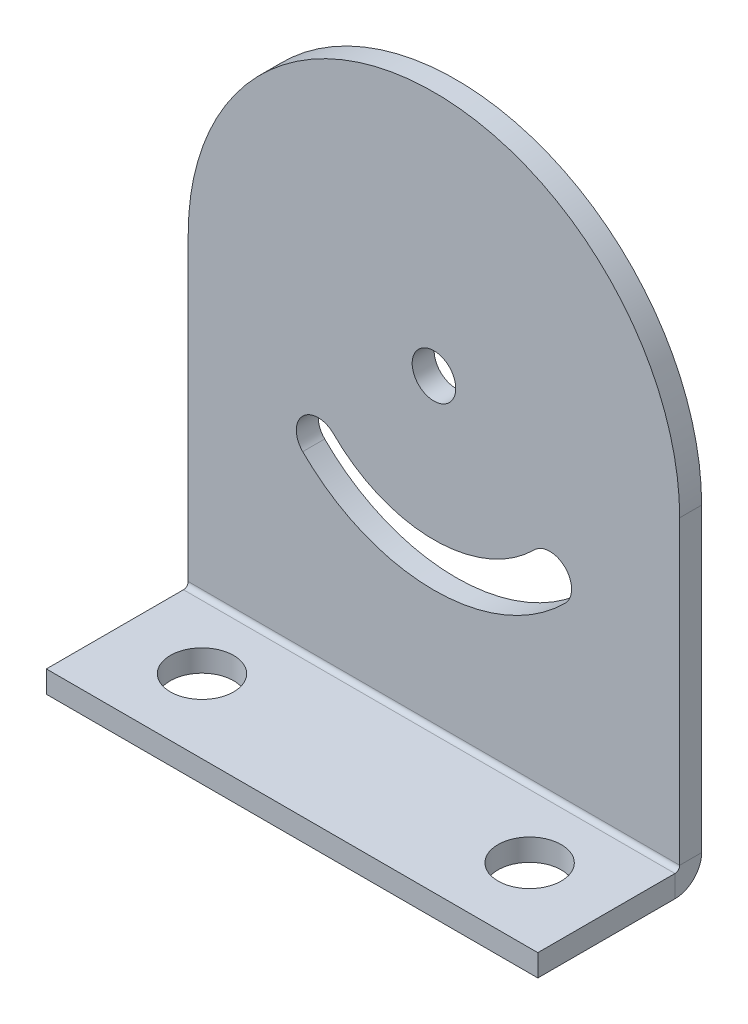
ISO-10303-21;
HEADER;
FILE_DESCRIPTION(('STEP AP214'),'2;1');
FILE_NAME('part.step','',(''),(''),'','','');
FILE_SCHEMA(('AUTOMOTIVE_DESIGN { 1 0 10303 214 1 1 1 1 }'));
ENDSEC;
DATA;
#1=APPLICATION_CONTEXT('core data for automotive mechanical design processes');
#2=APPLICATION_PROTOCOL_DEFINITION('international standard','automotive_design',2000,#1);
#3=PRODUCT_CONTEXT('',#1,'mechanical');
#4=PRODUCT('Part','Part','',(#3));
#5=PRODUCT_RELATED_PRODUCT_CATEGORY('part','',(#4));
#6=PRODUCT_DEFINITION_FORMATION('','',#4);
#7=PRODUCT_DEFINITION_CONTEXT('part definition',#1,'design');
#8=PRODUCT_DEFINITION('design','',#6,#7);
#9=PRODUCT_DEFINITION_SHAPE('','',#8);
#10=(LENGTH_UNIT() NAMED_UNIT(*) SI_UNIT(.MILLI.,.METRE.));
#11=(NAMED_UNIT(*) PLANE_ANGLE_UNIT() SI_UNIT($,.RADIAN.));
#12=(NAMED_UNIT(*) SI_UNIT($,.STERADIAN.) SOLID_ANGLE_UNIT());
#13=UNCERTAINTY_MEASURE_WITH_UNIT(LENGTH_MEASURE(1.E-05),#10,'distance_accuracy_value','');
#14=(GEOMETRIC_REPRESENTATION_CONTEXT(3) GLOBAL_UNCERTAINTY_ASSIGNED_CONTEXT((#13)) GLOBAL_UNIT_ASSIGNED_CONTEXT((#10,
#11,#12)) REPRESENTATION_CONTEXT('',''));
#15=CARTESIAN_POINT('',(0.,0.,0.));
#16=DIRECTION('',(0.,0.,1.));
#17=DIRECTION('',(1.,0.,0.));
#18=AXIS2_PLACEMENT_3D('',#15,#16,#17);
#19=CARTESIAN_POINT('',(0.,0.,-3.4036));
#20=DIRECTION('',(1.,0.,0.));
#21=DIRECTION('',(0.,1.,0.));
#22=AXIS2_PLACEMENT_3D('',#19,#20,#21);
#23=PLANE('',#22);
#24=DIRECTION('',(0.,1.,0.));
#25=VECTOR('',#24,1.);
#26=CARTESIAN_POINT('',(0.,0.,0.));
#27=LINE('',#26,#25);
#28=CARTESIAN_POINT('',(0.,-46.6598,0.));
#29=VERTEX_POINT('',#28);
#30=CARTESIAN_POINT('',(0.,0.,0.));
#31=VERTEX_POINT('',#30);
#32=EDGE_CURVE('E259',#29,#31,#27,.T.);
#33=ORIENTED_EDGE('',*,*,#32,.F.);
#34=DIRECTION('',(0.,0.,-1.));
#35=VECTOR('',#34,1.);
#36=CARTESIAN_POINT('',(0.,-46.6598,0.));
#37=LINE('',#36,#35);
#38=CARTESIAN_POINT('',(0.,-46.6598,-3.4036));
#39=VERTEX_POINT('',#38);
#40=EDGE_CURVE('E238',#29,#39,#37,.T.);
#41=ORIENTED_EDGE('',*,*,#40,.T.);
#42=DIRECTION('',(0.,1.,0.));
#43=VECTOR('',#42,1.);
#44=CARTESIAN_POINT('',(0.,0.,-3.4036));
#45=LINE('',#44,#43);
#46=CARTESIAN_POINT('',(0.,0.,-3.4036));
#47=VERTEX_POINT('',#46);
#48=EDGE_CURVE('E262',#39,#47,#45,.T.);
#49=ORIENTED_EDGE('',*,*,#48,.T.);
#50=DIRECTION('',(0.,0.,1.));
#51=VECTOR('',#50,1.);
#52=CARTESIAN_POINT('',(0.,0.,-3.4036));
#53=LINE('',#52,#51);
#54=EDGE_CURVE('E13',#47,#31,#53,.T.);
#55=ORIENTED_EDGE('',*,*,#54,.T.);
#56=EDGE_LOOP('',(#33,#41,#49,#55));
#57=FACE_BOUND('',#56,.T.);
#58=ADVANCED_FACE('F58',(#57),#23,.T.);
#59=CARTESIAN_POINT('',(-38.1,0.,-3.4036));
#60=DIRECTION('',(0.,0.,1.));
#61=DIRECTION('',(1.,0.,0.));
#62=AXIS2_PLACEMENT_3D('',#59,#60,#61);
#63=PLANE('',#62);
#64=CARTESIAN_POINT('',(-38.1,0.,-3.4036));
#65=DIRECTION('',(0.,0.,-1.));
#66=DIRECTION('',(1.,0.,0.));
#67=AXIS2_PLACEMENT_3D('',#64,#65,#66);
#68=CIRCLE('',#67,22.0194525515466);
#69=CARTESIAN_POINT('',(-22.529895782786,-15.570104217214,-3.4036));
#70=VERTEX_POINT('',#69);
#71=CARTESIAN_POINT('',(-53.670104217214,-15.570104217214,-3.4036));
#72=VERTEX_POINT('',#71);
#73=EDGE_CURVE('E155',#70,#72,#68,.T.);
#74=ORIENTED_EDGE('',*,*,#73,.T.);
#75=CARTESIAN_POINT('',(-56.0588523454184,-17.9588523454184,-3.4036));
#76=DIRECTION('',(0.,0.,1.));
#77=DIRECTION('',(1.,0.,0.));
#78=AXIS2_PLACEMENT_3D('',#75,#76,#77);
#79=CIRCLE('',#78,3.3782);
#80=CARTESIAN_POINT('',(-58.4476004736228,-20.3476004736227,-3.4036));
#81=VERTEX_POINT('',#80);
#82=EDGE_CURVE('E149',#72,#81,#79,.T.);
#83=ORIENTED_EDGE('',*,*,#82,.T.);
#84=CARTESIAN_POINT('',(-38.1,0.,-3.4036));
#85=DIRECTION('',(0.,0.,1.));
#86=DIRECTION('',(1.,0.,0.));
#87=AXIS2_PLACEMENT_3D('',#84,#85,#86);
#88=CIRCLE('',#87,28.7758525515465);
#89=CARTESIAN_POINT('',(-17.7523995263772,-20.3476004736228,-3.4036));
#90=VERTEX_POINT('',#89);
#91=EDGE_CURVE('E158',#81,#90,#88,.T.);
#92=ORIENTED_EDGE('',*,*,#91,.T.);
#93=CARTESIAN_POINT('',(-20.1411476545816,-17.9588523454184,-3.4036));
#94=DIRECTION('',(0.,0.,1.));
#95=DIRECTION('',(1.,0.,0.));
#96=AXIS2_PLACEMENT_3D('',#93,#94,#95);
#97=CIRCLE('',#96,3.3782);
#98=EDGE_CURVE('E73',#90,#70,#97,.T.);
#99=ORIENTED_EDGE('',*,*,#98,.T.);
#100=EDGE_LOOP('',(#74,#83,#92,#99));
#101=FACE_BOUND('',#100,.T.);
#102=CARTESIAN_POINT('',(-38.1,0.,-3.4036));
#103=DIRECTION('',(0.,0.,1.));
#104=DIRECTION('',(1.,0.,0.));
#105=AXIS2_PLACEMENT_3D('',#102,#103,#104);
#106=CIRCLE('',#105,3.3782);
#107=CARTESIAN_POINT('',(-34.7218,0.,-3.4036));
#108=VERTEX_POINT('',#107);
#109=EDGE_CURVE('E186',#108,#108,#106,.T.);
#110=ORIENTED_EDGE('',*,*,#109,.T.);
#111=EDGE_LOOP('',(#110));
#112=FACE_BOUND('',#111,.T.);
#113=DIRECTION('',(1.,0.,0.));
#114=VECTOR('',#113,1.);
#115=CARTESIAN_POINT('',(0.,-46.6598,-3.4036));
#116=LINE('',#115,#114);
#117=CARTESIAN_POINT('',(-76.2,-46.6598,-3.4036));
#118=VERTEX_POINT('',#117);
#119=EDGE_CURVE('E232',#39,#118,#116,.F.);
#120=ORIENTED_EDGE('',*,*,#119,.T.);
#121=DIRECTION('',(0.,-1.,0.));
#122=VECTOR('',#121,1.);
#123=CARTESIAN_POINT('',(-76.2,-50.8,-3.4036));
#124=LINE('',#123,#122);
#125=CARTESIAN_POINT('',(-76.2,0.,-3.4036));
#126=VERTEX_POINT('',#125);
#127=EDGE_CURVE('E258',#126,#118,#124,.T.);
#128=ORIENTED_EDGE('',*,*,#127,.F.);
#129=CARTESIAN_POINT('',(-38.1,0.,-3.4036));
#130=DIRECTION('',(0.,0.,1.));
#131=DIRECTION('',(1.,0.,0.));
#132=AXIS2_PLACEMENT_3D('',#129,#130,#131);
#133=CIRCLE('',#132,38.1);
#134=EDGE_CURVE('E255',#47,#126,#133,.T.);
#135=ORIENTED_EDGE('',*,*,#134,.F.);
#136=ORIENTED_EDGE('',*,*,#48,.F.);
#137=EDGE_LOOP('',(#120,#128,#135,#136));
#138=FACE_BOUND('',#137,.T.);
#139=ADVANCED_FACE('F162',(#101,#112,#138),#63,.F.);
#140=CARTESIAN_POINT('',(-38.1,0.,0.));
#141=DIRECTION('',(0.,0.,1.));
#142=DIRECTION('',(1.,0.,0.));
#143=AXIS2_PLACEMENT_3D('',#140,#141,#142);
#144=PLANE('',#143);
#145=CARTESIAN_POINT('',(-56.0588523454184,-17.9588523454184,0.));
#146=DIRECTION('',(0.,0.,1.));
#147=DIRECTION('',(1.,0.,0.));
#148=AXIS2_PLACEMENT_3D('',#145,#146,#147);
#149=CIRCLE('',#148,3.3782);
#150=CARTESIAN_POINT('',(-53.670104217214,-15.570104217214,0.));
#151=VERTEX_POINT('',#150);
#152=CARTESIAN_POINT('',(-58.4476004736228,-20.3476004736227,0.));
#153=VERTEX_POINT('',#152);
#154=EDGE_CURVE('E81',#151,#153,#149,.T.);
#155=ORIENTED_EDGE('',*,*,#154,.F.);
#156=CARTESIAN_POINT('',(-38.1,0.,0.));
#157=DIRECTION('',(0.,0.,-1.));
#158=DIRECTION('',(1.,0.,0.));
#159=AXIS2_PLACEMENT_3D('',#156,#157,#158);
#160=CIRCLE('',#159,22.0194525515466);
#161=CARTESIAN_POINT('',(-22.529895782786,-15.570104217214,0.));
#162=VERTEX_POINT('',#161);
#163=EDGE_CURVE('E165',#162,#151,#160,.T.);
#164=ORIENTED_EDGE('',*,*,#163,.F.);
#165=CARTESIAN_POINT('',(-20.1411476545816,-17.9588523454184,0.));
#166=DIRECTION('',(0.,0.,1.));
#167=DIRECTION('',(1.,0.,0.));
#168=AXIS2_PLACEMENT_3D('',#165,#166,#167);
#169=CIRCLE('',#168,3.3782);
#170=CARTESIAN_POINT('',(-17.7523995263772,-20.3476004736228,0.));
#171=VERTEX_POINT('',#170);
#172=EDGE_CURVE('E168',#171,#162,#169,.T.);
#173=ORIENTED_EDGE('',*,*,#172,.F.);
#174=CARTESIAN_POINT('',(-38.1,0.,0.));
#175=DIRECTION('',(0.,0.,1.));
#176=DIRECTION('',(1.,0.,0.));
#177=AXIS2_PLACEMENT_3D('',#174,#175,#176);
#178=CIRCLE('',#177,28.7758525515465);
#179=EDGE_CURVE('E174',#153,#171,#178,.T.);
#180=ORIENTED_EDGE('',*,*,#179,.F.);
#181=EDGE_LOOP('',(#155,#164,#173,#180));
#182=FACE_BOUND('',#181,.T.);
#183=CARTESIAN_POINT('',(-38.1,0.,0.));
#184=DIRECTION('',(0.,0.,1.));
#185=DIRECTION('',(1.,0.,0.));
#186=AXIS2_PLACEMENT_3D('',#183,#184,#185);
#187=CIRCLE('',#186,3.3782);
#188=CARTESIAN_POINT('',(-34.7218,0.,0.));
#189=VERTEX_POINT('',#188);
#190=EDGE_CURVE('E180',#189,#189,#187,.T.);
#191=ORIENTED_EDGE('',*,*,#190,.F.);
#192=EDGE_LOOP('',(#191));
#193=FACE_BOUND('',#192,.T.);
#194=DIRECTION('',(0.,-1.,0.));
#195=VECTOR('',#194,1.);
#196=CARTESIAN_POINT('',(-76.2,-50.8,0.));
#197=LINE('',#196,#195);
#198=CARTESIAN_POINT('',(-76.2,0.,0.));
#199=VERTEX_POINT('',#198);
#200=CARTESIAN_POINT('',(-76.2,-46.6598,0.));
#201=VERTEX_POINT('',#200);
#202=EDGE_CURVE('E266',#199,#201,#197,.T.);
#203=ORIENTED_EDGE('',*,*,#202,.T.);
#204=DIRECTION('',(1.,0.,0.));
#205=VECTOR('',#204,1.);
#206=CARTESIAN_POINT('',(0.,-46.6598,0.));
#207=LINE('',#206,#205);
#208=EDGE_CURVE('E244',#29,#201,#207,.F.);
#209=ORIENTED_EDGE('',*,*,#208,.F.);
#210=ORIENTED_EDGE('',*,*,#32,.T.);
#211=CARTESIAN_POINT('',(-38.1,0.,0.));
#212=DIRECTION('',(0.,0.,1.));
#213=DIRECTION('',(1.,0.,0.));
#214=AXIS2_PLACEMENT_3D('',#211,#212,#213);
#215=CIRCLE('',#214,38.1);
#216=EDGE_CURVE('E252',#31,#199,#215,.T.);
#217=ORIENTED_EDGE('',*,*,#216,.T.);
#218=EDGE_LOOP('',(#203,#209,#210,#217));
#219=FACE_BOUND('',#218,.T.);
#220=ADVANCED_FACE('F271',(#182,#193,#219),#144,.T.);
#221=CARTESIAN_POINT('',(-38.1,0.,-3.4036));
#222=DIRECTION('',(0.,0.,1.));
#223=DIRECTION('',(1.,0.,0.));
#224=AXIS2_PLACEMENT_3D('',#221,#222,#223);
#225=CYLINDRICAL_SURFACE('',#224,38.1);
#226=ORIENTED_EDGE('',*,*,#216,.F.);
#227=ORIENTED_EDGE('',*,*,#54,.F.);
#228=ORIENTED_EDGE('',*,*,#134,.T.);
#229=DIRECTION('',(0.,0.,1.));
#230=VECTOR('',#229,1.);
#231=CARTESIAN_POINT('',(-76.2,0.,-3.4036));
#232=LINE('',#231,#230);
#233=EDGE_CURVE('E62',#126,#199,#232,.T.);
#234=ORIENTED_EDGE('',*,*,#233,.T.);
#235=EDGE_LOOP('',(#226,#227,#228,#234));
#236=FACE_BOUND('',#235,.T.);
#237=ADVANCED_FACE('F60',(#236),#225,.T.);
#238=CARTESIAN_POINT('',(-76.2,-50.8,-3.4036));
#239=DIRECTION('',(-1.,0.,0.));
#240=DIRECTION('',(0.,-1.,0.));
#241=AXIS2_PLACEMENT_3D('',#238,#239,#240);
#242=PLANE('',#241);
#243=DIRECTION('',(0.,0.,-1.));
#244=VECTOR('',#243,1.);
#245=CARTESIAN_POINT('',(-76.2,-46.6598,0.));
#246=LINE('',#245,#244);
#247=EDGE_CURVE('E249',#201,#118,#246,.T.);
#248=ORIENTED_EDGE('',*,*,#247,.F.);
#249=ORIENTED_EDGE('',*,*,#202,.F.);
#250=ORIENTED_EDGE('',*,*,#233,.F.);
#251=ORIENTED_EDGE('',*,*,#127,.T.);
#252=EDGE_LOOP('',(#248,#249,#250,#251));
#253=FACE_BOUND('',#252,.T.);
#254=ADVANCED_FACE('F281',(#253),#242,.T.);
#255=CARTESIAN_POINT('',(-76.2,-46.6598,0.7366));
#256=DIRECTION('',(-1.,0.,0.));
#257=DIRECTION('',(0.,0.,1.));
#258=AXIS2_PLACEMENT_3D('',#255,#256,#257);
#259=PLANE('',#258);
#260=DIRECTION('',(0.,1.,0.));
#261=VECTOR('',#260,1.);
#262=CARTESIAN_POINT('',(-76.2,-50.8,0.736599999999985));
#263=LINE('',#262,#261);
#264=CARTESIAN_POINT('',(-76.2,-47.3964,0.736599999999997));
#265=VERTEX_POINT('',#264);
#266=CARTESIAN_POINT('',(-76.2,-50.8,0.736599999999985));
#267=VERTEX_POINT('',#266);
#268=EDGE_CURVE('E201',#265,#267,#263,.F.);
#269=ORIENTED_EDGE('',*,*,#268,.F.);
#270=CARTESIAN_POINT('',(-76.2,-46.6598,0.7366));
#271=DIRECTION('',(1.,0.,0.));
#272=DIRECTION('',(0.,0.,-1.));
#273=AXIS2_PLACEMENT_3D('',#270,#271,#272);
#274=CIRCLE('',#273,0.736600000000004);
#275=EDGE_CURVE('E241',#201,#265,#274,.F.);
#276=ORIENTED_EDGE('',*,*,#275,.F.);
#277=ORIENTED_EDGE('',*,*,#247,.T.);
#278=CARTESIAN_POINT('',(-76.2,-46.6598,0.7366));
#279=DIRECTION('',(1.,0.,0.));
#280=DIRECTION('',(0.,0.,-1.));
#281=AXIS2_PLACEMENT_3D('',#278,#279,#280);
#282=CIRCLE('',#281,4.1402);
#283=EDGE_CURVE('E234',#118,#267,#282,.F.);
#284=ORIENTED_EDGE('',*,*,#283,.T.);
#285=EDGE_LOOP('',(#269,#276,#277,#284));
#286=FACE_BOUND('',#285,.T.);
#287=ADVANCED_FACE('F288',(#286),#259,.T.);
#288=CARTESIAN_POINT('',(0.,-46.6598,0.736600000000006));
#289=DIRECTION('',(-1.,0.,0.));
#290=DIRECTION('',(0.,0.,1.));
#291=AXIS2_PLACEMENT_3D('',#288,#289,#290);
#292=PLANE('',#291);
#293=CARTESIAN_POINT('',(0.,-46.6598,0.736600000000006));
#294=DIRECTION('',(1.,0.,0.));
#295=DIRECTION('',(0.,0.,-1.));
#296=AXIS2_PLACEMENT_3D('',#293,#294,#295);
#297=CIRCLE('',#296,0.736600000000004);
#298=CARTESIAN_POINT('',(0.,-47.3964,0.736600000000003));
#299=VERTEX_POINT('',#298);
#300=EDGE_CURVE('E205',#299,#29,#297,.T.);
#301=ORIENTED_EDGE('',*,*,#300,.F.);
#302=DIRECTION('',(0.,1.,0.));
#303=VECTOR('',#302,1.);
#304=CARTESIAN_POINT('',(0.,-47.3964,0.736600000000004));
#305=LINE('',#304,#303);
#306=CARTESIAN_POINT('',(0.,-50.8,0.736599999999992));
#307=VERTEX_POINT('',#306);
#308=EDGE_CURVE('E225',#299,#307,#305,.F.);
#309=ORIENTED_EDGE('',*,*,#308,.T.);
#310=CARTESIAN_POINT('',(0.,-46.6598,0.736600000000006));
#311=DIRECTION('',(1.,0.,0.));
#312=DIRECTION('',(0.,0.,-1.));
#313=AXIS2_PLACEMENT_3D('',#310,#311,#312);
#314=CIRCLE('',#313,4.1402);
#315=EDGE_CURVE('E235',#307,#39,#314,.T.);
#316=ORIENTED_EDGE('',*,*,#315,.T.);
#317=ORIENTED_EDGE('',*,*,#40,.F.);
#318=EDGE_LOOP('',(#301,#309,#316,#317));
#319=FACE_BOUND('',#318,.T.);
#320=ADVANCED_FACE('F309',(#319),#292,.F.);
#321=CARTESIAN_POINT('',(0.,-46.6598,0.736600000000006));
#322=DIRECTION('',(1.,0.,0.));
#323=DIRECTION('',(0.,-1.,0.));
#324=AXIS2_PLACEMENT_3D('',#321,#322,#323);
#325=CYLINDRICAL_SURFACE('',#324,4.1402);
#326=ORIENTED_EDGE('',*,*,#119,.F.);
#327=ORIENTED_EDGE('',*,*,#315,.F.);
#328=DIRECTION('',(1.,0.,0.));
#329=VECTOR('',#328,1.);
#330=CARTESIAN_POINT('',(-76.2,-50.8,0.736599999999985));
#331=LINE('',#330,#329);
#332=EDGE_CURVE('E223',#307,#267,#331,.F.);
#333=ORIENTED_EDGE('',*,*,#332,.T.);
#334=ORIENTED_EDGE('',*,*,#283,.F.);
#335=EDGE_LOOP('',(#326,#327,#333,#334));
#336=FACE_BOUND('',#335,.T.);
#337=ADVANCED_FACE('F319',(#336),#325,.T.);
#338=CARTESIAN_POINT('',(0.,-46.6598,0.736600000000006));
#339=DIRECTION('',(1.,0.,0.));
#340=DIRECTION('',(0.,-1.,0.));
#341=AXIS2_PLACEMENT_3D('',#338,#339,#340);
#342=CYLINDRICAL_SURFACE('',#341,0.736600000000004);
#343=ORIENTED_EDGE('',*,*,#208,.T.);
#344=ORIENTED_EDGE('',*,*,#275,.T.);
#345=DIRECTION('',(1.,0.,0.));
#346=VECTOR('',#345,1.);
#347=CARTESIAN_POINT('',(-76.2,-47.3964,0.736599999999997));
#348=LINE('',#347,#346);
#349=EDGE_CURVE('E228',#265,#299,#348,.T.);
#350=ORIENTED_EDGE('',*,*,#349,.T.);
#351=ORIENTED_EDGE('',*,*,#300,.T.);
#352=EDGE_LOOP('',(#343,#344,#350,#351));
#353=FACE_BOUND('',#352,.T.);
#354=ADVANCED_FACE('F284',(#353),#342,.F.);
#355=CARTESIAN_POINT('',(0.,-50.8000000000001,21.9964));
#356=DIRECTION('',(-1.,0.,0.));
#357=DIRECTION('',(0.,0.,1.));
#358=AXIS2_PLACEMENT_3D('',#355,#356,#357);
#359=PLANE('',#358);
#360=ORIENTED_EDGE('',*,*,#308,.F.);
#361=DIRECTION('',(0.,0.,-1.));
#362=VECTOR('',#361,1.);
#363=CARTESIAN_POINT('',(0.,-47.3964000000001,21.9964));
#364=LINE('',#363,#362);
#365=CARTESIAN_POINT('',(0.,-47.3964000000001,21.9964));
#366=VERTEX_POINT('',#365);
#367=EDGE_CURVE('E221',#299,#366,#364,.F.);
#368=ORIENTED_EDGE('',*,*,#367,.T.);
#369=DIRECTION('',(0.,1.,0.));
#370=VECTOR('',#369,1.);
#371=CARTESIAN_POINT('',(0.,-50.8000000000001,21.9964));
#372=LINE('',#371,#370);
#373=CARTESIAN_POINT('',(0.,-50.8000000000001,21.9964));
#374=VERTEX_POINT('',#373);
#375=EDGE_CURVE('E202',#374,#366,#372,.T.);
#376=ORIENTED_EDGE('',*,*,#375,.F.);
#377=DIRECTION('',(0.,0.,1.));
#378=VECTOR('',#377,1.);
#379=CARTESIAN_POINT('',(0.,-50.8,-1.88160356330567E-13));
#380=LINE('',#379,#378);
#381=EDGE_CURVE('E214',#307,#374,#380,.T.);
#382=ORIENTED_EDGE('',*,*,#381,.F.);
#383=EDGE_LOOP('',(#360,#368,#376,#382));
#384=FACE_BOUND('',#383,.T.);
#385=ADVANCED_FACE('F311',(#384),#359,.F.);
#386=CARTESIAN_POINT('',(-76.2,-50.8,0.));
#387=DIRECTION('',(1.,0.,0.));
#388=DIRECTION('',(0.,0.,-1.));
#389=AXIS2_PLACEMENT_3D('',#386,#387,#388);
#390=PLANE('',#389);
#391=ORIENTED_EDGE('',*,*,#268,.T.);
#392=DIRECTION('',(0.,0.,-1.));
#393=VECTOR('',#392,1.);
#394=CARTESIAN_POINT('',(-76.2,-50.8,-3.80462265907672E-13));
#395=LINE('',#394,#393);
#396=CARTESIAN_POINT('',(-76.2,-50.8000000000001,21.9964));
#397=VERTEX_POINT('',#396);
#398=EDGE_CURVE('E209',#397,#267,#395,.T.);
#399=ORIENTED_EDGE('',*,*,#398,.F.);
#400=DIRECTION('',(0.,1.,0.));
#401=VECTOR('',#400,1.);
#402=CARTESIAN_POINT('',(-76.2,-50.8000000000001,21.9964));
#403=LINE('',#402,#401);
#404=CARTESIAN_POINT('',(-76.2,-47.3964000000001,21.9964));
#405=VERTEX_POINT('',#404);
#406=EDGE_CURVE('E206',#397,#405,#403,.T.);
#407=ORIENTED_EDGE('',*,*,#406,.T.);
#408=DIRECTION('',(0.,0.,1.));
#409=VECTOR('',#408,1.);
#410=CARTESIAN_POINT('',(-76.2,-47.3964,0.));
#411=LINE('',#410,#409);
#412=EDGE_CURVE('E216',#405,#265,#411,.F.);
#413=ORIENTED_EDGE('',*,*,#412,.T.);
#414=EDGE_LOOP('',(#391,#399,#407,#413));
#415=FACE_BOUND('',#414,.T.);
#416=ADVANCED_FACE('F292',(#415),#390,.F.);
#417=CARTESIAN_POINT('',(0.,-50.8,-1.88160356330567E-13));
#418=DIRECTION('',(0.,1.,0.));
#419=DIRECTION('',(0.,0.,1.));
#420=AXIS2_PLACEMENT_3D('',#417,#418,#419);
#421=PLANE('',#420);
#422=CARTESIAN_POINT('',(-63.5,-50.8000000000001,10.5664));
#423=DIRECTION('',(0.,1.,0.));
#424=DIRECTION('',(0.,0.,1.));
#425=AXIS2_PLACEMENT_3D('',#422,#423,#424);
#426=CIRCLE('',#425,4.9022);
#427=CARTESIAN_POINT('',(-63.5,-50.8000000000002,15.4686));
#428=VERTEX_POINT('',#427);
#429=EDGE_CURVE('E192',#428,#428,#426,.T.);
#430=ORIENTED_EDGE('',*,*,#429,.T.);
#431=EDGE_LOOP('',(#430));
#432=FACE_BOUND('',#431,.T.);
#433=CARTESIAN_POINT('',(-12.7,-50.8000000000001,10.5664));
#434=DIRECTION('',(0.,1.,0.));
#435=DIRECTION('',(0.,0.,1.));
#436=AXIS2_PLACEMENT_3D('',#433,#434,#435);
#437=CIRCLE('',#436,4.9022);
#438=CARTESIAN_POINT('',(-12.7,-50.8000000000001,15.4686));
#439=VERTEX_POINT('',#438);
#440=EDGE_CURVE('E198',#439,#439,#437,.T.);
#441=ORIENTED_EDGE('',*,*,#440,.T.);
#442=EDGE_LOOP('',(#441));
#443=FACE_BOUND('',#442,.T.);
#444=ORIENTED_EDGE('',*,*,#332,.F.);
#445=ORIENTED_EDGE('',*,*,#381,.T.);
#446=DIRECTION('',(-1.,0.,0.));
#447=VECTOR('',#446,1.);
#448=CARTESIAN_POINT('',(0.,-50.8000000000001,21.9964));
#449=LINE('',#448,#447);
#450=EDGE_CURVE('E212',#374,#397,#449,.T.);
#451=ORIENTED_EDGE('',*,*,#450,.T.);
#452=ORIENTED_EDGE('',*,*,#398,.T.);
#453=EDGE_LOOP('',(#444,#445,#451,#452));
#454=FACE_BOUND('',#453,.T.);
#455=ADVANCED_FACE('F296',(#432,#443,#454),#421,.F.);
#456=CARTESIAN_POINT('',(0.,-47.3964,-1.7627675044568E-13));
#457=DIRECTION('',(0.,1.,0.));
#458=DIRECTION('',(0.,0.,1.));
#459=AXIS2_PLACEMENT_3D('',#456,#457,#458);
#460=PLANE('',#459);
#461=CARTESIAN_POINT('',(-63.5,-47.3964,10.5664));
#462=DIRECTION('',(0.,1.,0.));
#463=DIRECTION('',(0.,0.,1.));
#464=AXIS2_PLACEMENT_3D('',#461,#462,#463);
#465=CIRCLE('',#464,4.9022);
#466=CARTESIAN_POINT('',(-63.5,-47.3964000000001,15.4686));
#467=VERTEX_POINT('',#466);
#468=EDGE_CURVE('E189',#467,#467,#465,.T.);
#469=ORIENTED_EDGE('',*,*,#468,.F.);
#470=EDGE_LOOP('',(#469));
#471=FACE_BOUND('',#470,.T.);
#472=CARTESIAN_POINT('',(-12.7,-47.3964,10.5664));
#473=DIRECTION('',(0.,1.,0.));
#474=DIRECTION('',(0.,0.,1.));
#475=AXIS2_PLACEMENT_3D('',#472,#473,#474);
#476=CIRCLE('',#475,4.9022);
#477=CARTESIAN_POINT('',(-12.7,-47.3964,15.4686));
#478=VERTEX_POINT('',#477);
#479=EDGE_CURVE('E195',#478,#478,#476,.T.);
#480=ORIENTED_EDGE('',*,*,#479,.F.);
#481=EDGE_LOOP('',(#480));
#482=FACE_BOUND('',#481,.T.);
#483=ORIENTED_EDGE('',*,*,#367,.F.);
#484=ORIENTED_EDGE('',*,*,#349,.F.);
#485=ORIENTED_EDGE('',*,*,#412,.F.);
#486=DIRECTION('',(1.,0.,0.));
#487=VECTOR('',#486,1.);
#488=CARTESIAN_POINT('',(-76.2,-47.3964000000001,21.9964));
#489=LINE('',#488,#487);
#490=EDGE_CURVE('E219',#366,#405,#489,.F.);
#491=ORIENTED_EDGE('',*,*,#490,.F.);
#492=EDGE_LOOP('',(#483,#484,#485,#491));
#493=FACE_BOUND('',#492,.T.);
#494=ADVANCED_FACE('F306',(#471,#482,#493),#460,.T.);
#495=CARTESIAN_POINT('',(-76.2,-50.8000000000001,21.9964));
#496=DIRECTION('',(0.,0.,-1.));
#497=DIRECTION('',(0.,1.,0.));
#498=AXIS2_PLACEMENT_3D('',#495,#496,#497);
#499=PLANE('',#498);
#500=ORIENTED_EDGE('',*,*,#490,.T.);
#501=ORIENTED_EDGE('',*,*,#406,.F.);
#502=ORIENTED_EDGE('',*,*,#450,.F.);
#503=ORIENTED_EDGE('',*,*,#375,.T.);
#504=EDGE_LOOP('',(#500,#501,#502,#503));
#505=FACE_BOUND('',#504,.T.);
#506=ADVANCED_FACE('F302',(#505),#499,.F.);
#507=CARTESIAN_POINT('',(-12.7,-47.3964,10.5664));
#508=DIRECTION('',(0.,1.,0.));
#509=DIRECTION('',(0.,0.,1.));
#510=AXIS2_PLACEMENT_3D('',#507,#508,#509);
#511=CYLINDRICAL_SURFACE('',#510,4.9022);
#512=ORIENTED_EDGE('',*,*,#440,.F.);
#513=EDGE_LOOP('',(#512));
#514=FACE_BOUND('',#513,.T.);
#515=ORIENTED_EDGE('',*,*,#479,.T.);
#516=EDGE_LOOP('',(#515));
#517=FACE_BOUND('',#516,.T.);
#518=ADVANCED_FACE('F357',(#514,#517),#511,.F.);
#519=CARTESIAN_POINT('',(-63.5,-47.3964,10.5664));
#520=DIRECTION('',(0.,1.,0.));
#521=DIRECTION('',(0.,0.,1.));
#522=AXIS2_PLACEMENT_3D('',#519,#520,#521);
#523=CYLINDRICAL_SURFACE('',#522,4.9022);
#524=ORIENTED_EDGE('',*,*,#429,.F.);
#525=EDGE_LOOP('',(#524));
#526=FACE_BOUND('',#525,.T.);
#527=ORIENTED_EDGE('',*,*,#468,.T.);
#528=EDGE_LOOP('',(#527));
#529=FACE_BOUND('',#528,.T.);
#530=ADVANCED_FACE('F348',(#526,#529),#523,.F.);
#531=CARTESIAN_POINT('',(-38.1,0.,0.));
#532=DIRECTION('',(0.,0.,1.));
#533=DIRECTION('',(1.,0.,0.));
#534=AXIS2_PLACEMENT_3D('',#531,#532,#533);
#535=CYLINDRICAL_SURFACE('',#534,3.3782);
#536=ORIENTED_EDGE('',*,*,#109,.F.);
#537=EDGE_LOOP('',(#536));
#538=FACE_BOUND('',#537,.T.);
#539=ORIENTED_EDGE('',*,*,#190,.T.);
#540=EDGE_LOOP('',(#539));
#541=FACE_BOUND('',#540,.T.);
#542=ADVANCED_FACE('F346',(#538,#541),#535,.F.);
#543=CARTESIAN_POINT('',(-56.0588523454184,-17.9588523454184,-3.4036));
#544=DIRECTION('',(0.,0.,1.));
#545=DIRECTION('',(1.,0.,0.));
#546=AXIS2_PLACEMENT_3D('',#543,#544,#545);
#547=CYLINDRICAL_SURFACE('',#546,3.3782);
#548=ORIENTED_EDGE('',*,*,#154,.T.);
#549=DIRECTION('',(0.,0.,1.));
#550=VECTOR('',#549,1.);
#551=CARTESIAN_POINT('',(-58.4476004736228,-20.3476004736227,-3.4036));
#552=LINE('',#551,#550);
#553=EDGE_CURVE('E145',#81,#153,#552,.T.);
#554=ORIENTED_EDGE('',*,*,#553,.F.);
#555=ORIENTED_EDGE('',*,*,#82,.F.);
#556=DIRECTION('',(0.,0.,1.));
#557=VECTOR('',#556,1.);
#558=CARTESIAN_POINT('',(-53.670104217214,-15.570104217214,-3.4036));
#559=LINE('',#558,#557);
#560=EDGE_CURVE('E178',#72,#151,#559,.T.);
#561=ORIENTED_EDGE('',*,*,#560,.T.);
#562=EDGE_LOOP('',(#548,#554,#555,#561));
#563=FACE_BOUND('',#562,.T.);
#564=ADVANCED_FACE('F147',(#563),#547,.F.);
#565=CARTESIAN_POINT('',(-38.1,0.,-3.4036));
#566=DIRECTION('',(0.,0.,1.));
#567=DIRECTION('',(1.,0.,0.));
#568=AXIS2_PLACEMENT_3D('',#565,#566,#567);
#569=CYLINDRICAL_SURFACE('',#568,22.0194525515466);
#570=ORIENTED_EDGE('',*,*,#163,.T.);
#571=ORIENTED_EDGE('',*,*,#560,.F.);
#572=ORIENTED_EDGE('',*,*,#73,.F.);
#573=DIRECTION('',(0.,0.,1.));
#574=VECTOR('',#573,1.);
#575=CARTESIAN_POINT('',(-22.529895782786,-15.570104217214,-3.4036));
#576=LINE('',#575,#574);
#577=EDGE_CURVE('E181',#70,#162,#576,.T.);
#578=ORIENTED_EDGE('',*,*,#577,.T.);
#579=EDGE_LOOP('',(#570,#571,#572,#578));
#580=FACE_BOUND('',#579,.T.);
#581=ADVANCED_FACE('F355',(#580),#569,.T.);
#582=CARTESIAN_POINT('',(-20.1411476545816,-17.9588523454184,-3.4036));
#583=DIRECTION('',(0.,0.,1.));
#584=DIRECTION('',(1.,0.,0.));
#585=AXIS2_PLACEMENT_3D('',#582,#583,#584);
#586=CYLINDRICAL_SURFACE('',#585,3.3782);
#587=ORIENTED_EDGE('',*,*,#172,.T.);
#588=ORIENTED_EDGE('',*,*,#577,.F.);
#589=ORIENTED_EDGE('',*,*,#98,.F.);
#590=DIRECTION('',(0.,0.,1.));
#591=VECTOR('',#590,1.);
#592=CARTESIAN_POINT('',(-17.7523995263772,-20.3476004736228,-3.4036));
#593=LINE('',#592,#591);
#594=EDGE_CURVE('E154',#90,#171,#593,.T.);
#595=ORIENTED_EDGE('',*,*,#594,.T.);
#596=EDGE_LOOP('',(#587,#588,#589,#595));
#597=FACE_BOUND('',#596,.T.);
#598=ADVANCED_FACE('F418',(#597),#586,.F.);
#599=CARTESIAN_POINT('',(-38.1,0.,-3.4036));
#600=DIRECTION('',(0.,0.,1.));
#601=DIRECTION('',(1.,0.,0.));
#602=AXIS2_PLACEMENT_3D('',#599,#600,#601);
#603=CYLINDRICAL_SURFACE('',#602,28.7758525515465);
#604=ORIENTED_EDGE('',*,*,#179,.T.);
#605=ORIENTED_EDGE('',*,*,#594,.F.);
#606=ORIENTED_EDGE('',*,*,#91,.F.);
#607=ORIENTED_EDGE('',*,*,#553,.T.);
#608=EDGE_LOOP('',(#604,#605,#606,#607));
#609=FACE_BOUND('',#608,.T.);
#610=ADVANCED_FACE('F159',(#609),#603,.F.);
#611=CLOSED_SHELL('',(#58,#139,#220,#237,#254,#287,#320,#337,#354,#385,#416,#455,#494,#506,#518,
#530,#542,#564,#581,#598,#610));
#612=MANIFOLD_SOLID_BREP('B2',#611);
#613=ADVANCED_BREP_SHAPE_REPRESENTATION('',(#18,#612),#14);
#614=SHAPE_DEFINITION_REPRESENTATION(#9,#613);
ENDSEC;
END-ISO-10303-21;
